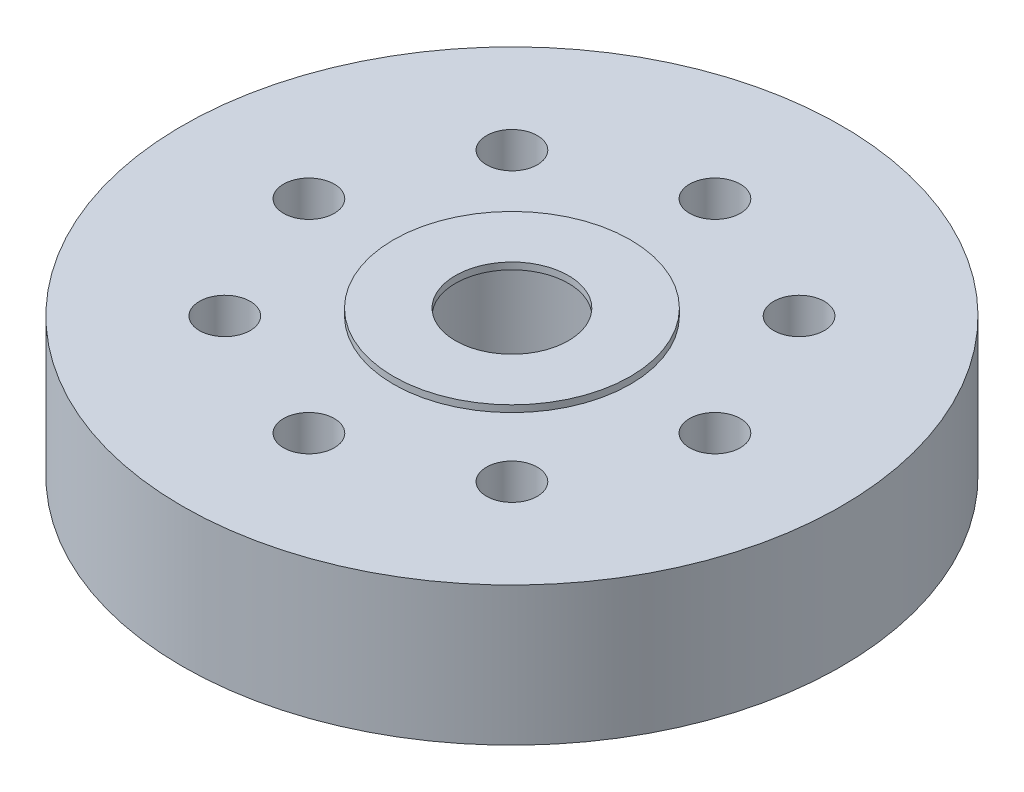
ISO-10303-21;
HEADER;
FILE_DESCRIPTION(('STEP AP214'),'2;1');
FILE_NAME('part.step','',(''),(''),'','','');
FILE_SCHEMA(('AUTOMOTIVE_DESIGN { 1 0 10303 214 1 1 1 1 }'));
ENDSEC;
DATA;
#1=APPLICATION_CONTEXT('core data for automotive mechanical design processes');
#2=APPLICATION_PROTOCOL_DEFINITION('international standard','automotive_design',2000,#1);
#3=PRODUCT_CONTEXT('',#1,'mechanical');
#4=PRODUCT('Part','Part','',(#3));
#5=PRODUCT_RELATED_PRODUCT_CATEGORY('part','',(#4));
#6=PRODUCT_DEFINITION_FORMATION('','',#4);
#7=PRODUCT_DEFINITION_CONTEXT('part definition',#1,'design');
#8=PRODUCT_DEFINITION('design','',#6,#7);
#9=PRODUCT_DEFINITION_SHAPE('','',#8);
#10=(LENGTH_UNIT() NAMED_UNIT(*) SI_UNIT(.MILLI.,.METRE.));
#11=(NAMED_UNIT(*) PLANE_ANGLE_UNIT() SI_UNIT($,.RADIAN.));
#12=(NAMED_UNIT(*) SI_UNIT($,.STERADIAN.) SOLID_ANGLE_UNIT());
#13=UNCERTAINTY_MEASURE_WITH_UNIT(LENGTH_MEASURE(1.E-05),#10,'distance_accuracy_value','');
#14=(GEOMETRIC_REPRESENTATION_CONTEXT(3) GLOBAL_UNCERTAINTY_ASSIGNED_CONTEXT((#13)) GLOBAL_UNIT_ASSIGNED_CONTEXT((#10,
#11,#12)) REPRESENTATION_CONTEXT('',''));
#15=CARTESIAN_POINT('',(0.,0.,0.));
#16=DIRECTION('',(0.,0.,1.));
#17=DIRECTION('',(1.,0.,0.));
#18=AXIS2_PLACEMENT_3D('',#15,#16,#17);
#19=CARTESIAN_POINT('',(0.,4.1,0.));
#20=DIRECTION('',(0.,1.,0.));
#21=DIRECTION('',(0.,0.,1.));
#22=AXIS2_PLACEMENT_3D('',#19,#20,#21);
#23=PLANE('',#22);
#24=CARTESIAN_POINT('',(6.,4.1,0.));
#25=DIRECTION('',(0.,1.,0.));
#26=DIRECTION('',(0.,0.,1.));
#27=AXIS2_PLACEMENT_3D('',#24,#25,#26);
#28=CIRCLE('',#27,0.749999999999998);
#29=CARTESIAN_POINT('',(6.,4.1,0.749999999999998));
#30=VERTEX_POINT('',#29);
#31=EDGE_CURVE('E104',#30,#30,#28,.T.);
#32=ORIENTED_EDGE('',*,*,#31,.F.);
#33=EDGE_LOOP('',(#32));
#34=FACE_BOUND('',#33,.T.);
#35=CARTESIAN_POINT('',(4.24264068711926,4.1,4.24264068711928));
#36=DIRECTION('',(0.,1.,0.));
#37=DIRECTION('',(0.,0.,1.));
#38=AXIS2_PLACEMENT_3D('',#35,#36,#37);
#39=CIRCLE('',#38,0.749999999999998);
#40=CARTESIAN_POINT('',(4.24264068711926,4.1,4.99264068711927));
#41=VERTEX_POINT('',#40);
#42=EDGE_CURVE('E98',#41,#41,#39,.T.);
#43=ORIENTED_EDGE('',*,*,#42,.F.);
#44=EDGE_LOOP('',(#43));
#45=FACE_BOUND('',#44,.T.);
#46=CARTESIAN_POINT('',(0.,4.1,5.99999999999996));
#47=DIRECTION('',(0.,1.,0.));
#48=DIRECTION('',(0.,0.,1.));
#49=AXIS2_PLACEMENT_3D('',#46,#47,#48);
#50=CIRCLE('',#49,0.749999999999998);
#51=CARTESIAN_POINT('',(0.,4.1,6.74999999999996));
#52=VERTEX_POINT('',#51);
#53=EDGE_CURVE('E92',#52,#52,#50,.T.);
#54=ORIENTED_EDGE('',*,*,#53,.F.);
#55=EDGE_LOOP('',(#54));
#56=FACE_BOUND('',#55,.T.);
#57=CARTESIAN_POINT('',(-4.24264068711931,4.1,4.24264068711922));
#58=DIRECTION('',(0.,1.,0.));
#59=DIRECTION('',(0.,0.,1.));
#60=AXIS2_PLACEMENT_3D('',#57,#58,#59);
#61=CIRCLE('',#60,0.749999999999998);
#62=CARTESIAN_POINT('',(-4.24264068711931,4.1,4.99264068711922));
#63=VERTEX_POINT('',#62);
#64=EDGE_CURVE('E86',#63,#63,#61,.T.);
#65=ORIENTED_EDGE('',*,*,#64,.F.);
#66=EDGE_LOOP('',(#65));
#67=FACE_BOUND('',#66,.T.);
#68=CARTESIAN_POINT('',(-6.,4.1,0.));
#69=DIRECTION('',(0.,1.,0.));
#70=DIRECTION('',(0.,0.,1.));
#71=AXIS2_PLACEMENT_3D('',#68,#69,#70);
#72=CIRCLE('',#71,0.749999999999998);
#73=CARTESIAN_POINT('',(-6.,4.1,0.749999999999927));
#74=VERTEX_POINT('',#73);
#75=EDGE_CURVE('E80',#74,#74,#72,.T.);
#76=ORIENTED_EDGE('',*,*,#75,.F.);
#77=EDGE_LOOP('',(#76));
#78=FACE_BOUND('',#77,.T.);
#79=CARTESIAN_POINT('',(-4.24264068711926,4.1,-4.24264068711935));
#80=DIRECTION('',(0.,1.,0.));
#81=DIRECTION('',(0.,0.,1.));
#82=AXIS2_PLACEMENT_3D('',#79,#80,#81);
#83=CIRCLE('',#82,0.749999999999998);
#84=CARTESIAN_POINT('',(-4.24264068711926,4.1,-3.49264068711935));
#85=VERTEX_POINT('',#84);
#86=EDGE_CURVE('E74',#85,#85,#83,.T.);
#87=ORIENTED_EDGE('',*,*,#86,.F.);
#88=EDGE_LOOP('',(#87));
#89=FACE_BOUND('',#88,.T.);
#90=CARTESIAN_POINT('',(0.,4.1,-6.00000000000004));
#91=DIRECTION('',(0.,1.,0.));
#92=DIRECTION('',(0.,0.,1.));
#93=AXIS2_PLACEMENT_3D('',#90,#91,#92);
#94=CIRCLE('',#93,0.749999999999999);
#95=CARTESIAN_POINT('',(0.,4.1,-5.25000000000004));
#96=VERTEX_POINT('',#95);
#97=EDGE_CURVE('E68',#96,#96,#94,.T.);
#98=ORIENTED_EDGE('',*,*,#97,.F.);
#99=EDGE_LOOP('',(#98));
#100=FACE_BOUND('',#99,.T.);
#101=CARTESIAN_POINT('',(4.24264068711931,4.1,-4.2426406871193));
#102=DIRECTION('',(0.,1.,0.));
#103=DIRECTION('',(0.,0.,1.));
#104=AXIS2_PLACEMENT_3D('',#101,#102,#103);
#105=CIRCLE('',#104,0.749999999999998);
#106=CARTESIAN_POINT('',(4.24264068711931,4.1,-3.4926406871193));
#107=VERTEX_POINT('',#106);
#108=EDGE_CURVE('E62',#107,#107,#105,.T.);
#109=ORIENTED_EDGE('',*,*,#108,.F.);
#110=EDGE_LOOP('',(#109));
#111=FACE_BOUND('',#110,.T.);
#112=CARTESIAN_POINT('',(0.,4.1,0.));
#113=DIRECTION('',(0.,1.,0.));
#114=DIRECTION('',(0.,0.,1.));
#115=AXIS2_PLACEMENT_3D('',#112,#113,#114);
#116=CIRCLE('',#115,3.5);
#117=CARTESIAN_POINT('',(0.,4.1,3.5));
#118=VERTEX_POINT('',#117);
#119=EDGE_CURVE('E50',#118,#118,#116,.T.);
#120=ORIENTED_EDGE('',*,*,#119,.F.);
#121=EDGE_LOOP('',(#120));
#122=FACE_BOUND('',#121,.T.);
#123=CARTESIAN_POINT('',(0.,4.1,0.));
#124=DIRECTION('',(0.,1.,0.));
#125=DIRECTION('',(0.,0.,1.));
#126=AXIS2_PLACEMENT_3D('',#123,#124,#125);
#127=CIRCLE('',#126,9.74);
#128=CARTESIAN_POINT('',(0.,4.1,9.74));
#129=VERTEX_POINT('',#128);
#130=EDGE_CURVE('E10',#129,#129,#127,.T.);
#131=ORIENTED_EDGE('',*,*,#130,.T.);
#132=EDGE_LOOP('',(#131));
#133=FACE_BOUND('',#132,.T.);
#134=ADVANCED_FACE('F31',(#34,#45,#56,#67,#78,#89,#100,#111,#122,#133),#23,.T.);
#135=CARTESIAN_POINT('',(0.,0.,0.));
#136=DIRECTION('',(0.,1.,0.));
#137=DIRECTION('',(0.,0.,1.));
#138=AXIS2_PLACEMENT_3D('',#135,#136,#137);
#139=PLANE('',#138);
#140=CARTESIAN_POINT('',(6.,0.,0.));
#141=DIRECTION('',(0.,1.,0.));
#142=DIRECTION('',(0.,0.,1.));
#143=AXIS2_PLACEMENT_3D('',#140,#141,#142);
#144=CIRCLE('',#143,0.749999999999998);
#145=CARTESIAN_POINT('',(6.,0.,0.749999999999998));
#146=VERTEX_POINT('',#145);
#147=EDGE_CURVE('E59',#146,#146,#144,.T.);
#148=ORIENTED_EDGE('',*,*,#147,.T.);
#149=EDGE_LOOP('',(#148));
#150=FACE_BOUND('',#149,.T.);
#151=CARTESIAN_POINT('',(4.24264068711926,0.,4.24264068711928));
#152=DIRECTION('',(0.,1.,0.));
#153=DIRECTION('',(0.,0.,1.));
#154=AXIS2_PLACEMENT_3D('',#151,#152,#153);
#155=CIRCLE('',#154,0.749999999999998);
#156=CARTESIAN_POINT('',(4.24264068711926,0.,4.99264068711927));
#157=VERTEX_POINT('',#156);
#158=EDGE_CURVE('E101',#157,#157,#155,.T.);
#159=ORIENTED_EDGE('',*,*,#158,.T.);
#160=EDGE_LOOP('',(#159));
#161=FACE_BOUND('',#160,.T.);
#162=CARTESIAN_POINT('',(0.,0.,5.99999999999996));
#163=DIRECTION('',(0.,1.,0.));
#164=DIRECTION('',(0.,0.,1.));
#165=AXIS2_PLACEMENT_3D('',#162,#163,#164);
#166=CIRCLE('',#165,0.749999999999998);
#167=CARTESIAN_POINT('',(0.,0.,6.74999999999996));
#168=VERTEX_POINT('',#167);
#169=EDGE_CURVE('E95',#168,#168,#166,.T.);
#170=ORIENTED_EDGE('',*,*,#169,.T.);
#171=EDGE_LOOP('',(#170));
#172=FACE_BOUND('',#171,.T.);
#173=CARTESIAN_POINT('',(-4.24264068711931,0.,4.24264068711922));
#174=DIRECTION('',(0.,1.,0.));
#175=DIRECTION('',(0.,0.,1.));
#176=AXIS2_PLACEMENT_3D('',#173,#174,#175);
#177=CIRCLE('',#176,0.749999999999998);
#178=CARTESIAN_POINT('',(-4.24264068711931,0.,4.99264068711922));
#179=VERTEX_POINT('',#178);
#180=EDGE_CURVE('E89',#179,#179,#177,.T.);
#181=ORIENTED_EDGE('',*,*,#180,.T.);
#182=EDGE_LOOP('',(#181));
#183=FACE_BOUND('',#182,.T.);
#184=CARTESIAN_POINT('',(-6.,0.,0.));
#185=DIRECTION('',(0.,1.,0.));
#186=DIRECTION('',(0.,0.,1.));
#187=AXIS2_PLACEMENT_3D('',#184,#185,#186);
#188=CIRCLE('',#187,0.749999999999998);
#189=CARTESIAN_POINT('',(-6.,0.,0.749999999999927));
#190=VERTEX_POINT('',#189);
#191=EDGE_CURVE('E83',#190,#190,#188,.T.);
#192=ORIENTED_EDGE('',*,*,#191,.T.);
#193=EDGE_LOOP('',(#192));
#194=FACE_BOUND('',#193,.T.);
#195=CARTESIAN_POINT('',(-4.24264068711926,0.,-4.24264068711935));
#196=DIRECTION('',(0.,1.,0.));
#197=DIRECTION('',(0.,0.,1.));
#198=AXIS2_PLACEMENT_3D('',#195,#196,#197);
#199=CIRCLE('',#198,0.749999999999998);
#200=CARTESIAN_POINT('',(-4.24264068711926,0.,-3.49264068711935));
#201=VERTEX_POINT('',#200);
#202=EDGE_CURVE('E77',#201,#201,#199,.T.);
#203=ORIENTED_EDGE('',*,*,#202,.T.);
#204=EDGE_LOOP('',(#203));
#205=FACE_BOUND('',#204,.T.);
#206=CARTESIAN_POINT('',(0.,0.,-6.00000000000004));
#207=DIRECTION('',(0.,1.,0.));
#208=DIRECTION('',(0.,0.,1.));
#209=AXIS2_PLACEMENT_3D('',#206,#207,#208);
#210=CIRCLE('',#209,0.749999999999999);
#211=CARTESIAN_POINT('',(0.,0.,-5.25000000000004));
#212=VERTEX_POINT('',#211);
#213=EDGE_CURVE('E71',#212,#212,#210,.T.);
#214=ORIENTED_EDGE('',*,*,#213,.T.);
#215=EDGE_LOOP('',(#214));
#216=FACE_BOUND('',#215,.T.);
#217=CARTESIAN_POINT('',(4.24264068711931,0.,-4.2426406871193));
#218=DIRECTION('',(0.,1.,0.));
#219=DIRECTION('',(0.,0.,1.));
#220=AXIS2_PLACEMENT_3D('',#217,#218,#219);
#221=CIRCLE('',#220,0.749999999999998);
#222=CARTESIAN_POINT('',(4.24264068711931,0.,-3.4926406871193));
#223=VERTEX_POINT('',#222);
#224=EDGE_CURVE('E65',#223,#223,#221,.T.);
#225=ORIENTED_EDGE('',*,*,#224,.T.);
#226=EDGE_LOOP('',(#225));
#227=FACE_BOUND('',#226,.T.);
#228=CARTESIAN_POINT('',(0.,0.,0.));
#229=DIRECTION('',(0.,1.,0.));
#230=DIRECTION('',(0.,0.,1.));
#231=AXIS2_PLACEMENT_3D('',#228,#229,#230);
#232=CIRCLE('',#231,9.74);
#233=CARTESIAN_POINT('',(0.,0.,9.74));
#234=VERTEX_POINT('',#233);
#235=EDGE_CURVE('E35',#234,#234,#232,.T.);
#236=ORIENTED_EDGE('',*,*,#235,.F.);
#237=EDGE_LOOP('',(#236));
#238=FACE_BOUND('',#237,.T.);
#239=CARTESIAN_POINT('',(0.,0.,0.));
#240=DIRECTION('',(0.,1.,0.));
#241=DIRECTION('',(0.,0.,1.));
#242=AXIS2_PLACEMENT_3D('',#239,#240,#241);
#243=CIRCLE('',#242,2.57);
#244=CARTESIAN_POINT('',(0.,0.,2.57));
#245=VERTEX_POINT('',#244);
#246=EDGE_CURVE('E42',#245,#245,#243,.T.);
#247=ORIENTED_EDGE('',*,*,#246,.T.);
#248=EDGE_LOOP('',(#247));
#249=FACE_BOUND('',#248,.T.);
#250=ADVANCED_FACE('F110',(#150,#161,#172,#183,#194,#205,#216,#227,#238,#249),#139,.F.);
#251=CARTESIAN_POINT('',(0.,4.1,0.));
#252=DIRECTION('',(0.,-1.,0.));
#253=DIRECTION('',(0.,0.,-1.));
#254=AXIS2_PLACEMENT_3D('',#251,#252,#253);
#255=CYLINDRICAL_SURFACE('',#254,9.74);
#256=ORIENTED_EDGE('',*,*,#130,.F.);
#257=EDGE_LOOP('',(#256));
#258=FACE_BOUND('',#257,.T.);
#259=ORIENTED_EDGE('',*,*,#235,.T.);
#260=EDGE_LOOP('',(#259));
#261=FACE_BOUND('',#260,.T.);
#262=ADVANCED_FACE('F33',(#258,#261),#255,.T.);
#263=CARTESIAN_POINT('',(0.,4.1,0.));
#264=DIRECTION('',(0.,-1.,0.));
#265=DIRECTION('',(0.,0.,-1.));
#266=AXIS2_PLACEMENT_3D('',#263,#264,#265);
#267=CYLINDRICAL_SURFACE('',#266,2.57);
#268=CARTESIAN_POINT('',(0.,4.1,0.));
#269=DIRECTION('',(0.,1.,0.));
#270=DIRECTION('',(0.,0.,1.));
#271=AXIS2_PLACEMENT_3D('',#268,#269,#270);
#272=CIRCLE('',#271,2.57);
#273=CARTESIAN_POINT('',(0.,4.1,2.57));
#274=VERTEX_POINT('',#273);
#275=EDGE_CURVE('E46',#274,#274,#272,.T.);
#276=ORIENTED_EDGE('',*,*,#275,.T.);
#277=EDGE_LOOP('',(#276));
#278=FACE_BOUND('',#277,.T.);
#279=ORIENTED_EDGE('',*,*,#246,.F.);
#280=EDGE_LOOP('',(#279));
#281=FACE_BOUND('',#280,.T.);
#282=ADVANCED_FACE('F158',(#278,#281),#267,.F.);
#283=CARTESIAN_POINT('',(0.,4.1,0.));
#284=DIRECTION('',(0.,1.,0.));
#285=DIRECTION('',(0.,0.,1.));
#286=AXIS2_PLACEMENT_3D('',#283,#284,#285);
#287=PLANE('',#286);
#288=CARTESIAN_POINT('',(0.,4.1,0.));
#289=DIRECTION('',(0.,1.,0.));
#290=DIRECTION('',(0.,0.,1.));
#291=AXIS2_PLACEMENT_3D('',#288,#289,#290);
#292=CIRCLE('',#291,1.67);
#293=CARTESIAN_POINT('',(0.,4.1,1.67));
#294=VERTEX_POINT('',#293);
#295=EDGE_CURVE('E56',#294,#294,#292,.T.);
#296=ORIENTED_EDGE('',*,*,#295,.T.);
#297=EDGE_LOOP('',(#296));
#298=FACE_BOUND('',#297,.T.);
#299=ORIENTED_EDGE('',*,*,#275,.F.);
#300=EDGE_LOOP('',(#299));
#301=FACE_BOUND('',#300,.T.);
#302=ADVANCED_FACE('F152',(#298,#301),#287,.F.);
#303=CARTESIAN_POINT('',(0.,4.3,0.));
#304=DIRECTION('',(0.,1.,0.));
#305=DIRECTION('',(0.,0.,1.));
#306=AXIS2_PLACEMENT_3D('',#303,#304,#305);
#307=PLANE('',#306);
#308=CARTESIAN_POINT('',(0.,4.3,0.));
#309=DIRECTION('',(0.,1.,0.));
#310=DIRECTION('',(0.,0.,1.));
#311=AXIS2_PLACEMENT_3D('',#308,#309,#310);
#312=CIRCLE('',#311,3.5);
#313=CARTESIAN_POINT('',(0.,4.3,3.5));
#314=VERTEX_POINT('',#313);
#315=EDGE_CURVE('E49',#314,#314,#312,.T.);
#316=ORIENTED_EDGE('',*,*,#315,.T.);
#317=EDGE_LOOP('',(#316));
#318=FACE_BOUND('',#317,.T.);
#319=CARTESIAN_POINT('',(0.,4.3,0.));
#320=DIRECTION('',(0.,1.,0.));
#321=DIRECTION('',(0.,0.,1.));
#322=AXIS2_PLACEMENT_3D('',#319,#320,#321);
#323=CIRCLE('',#322,1.67);
#324=CARTESIAN_POINT('',(0.,4.3,1.67));
#325=VERTEX_POINT('',#324);
#326=EDGE_CURVE('E53',#325,#325,#323,.T.);
#327=ORIENTED_EDGE('',*,*,#326,.F.);
#328=EDGE_LOOP('',(#327));
#329=FACE_BOUND('',#328,.T.);
#330=ADVANCED_FACE('F142',(#318,#329),#307,.T.);
#331=CARTESIAN_POINT('',(0.,4.3,0.));
#332=DIRECTION('',(0.,-1.,0.));
#333=DIRECTION('',(0.,0.,-1.));
#334=AXIS2_PLACEMENT_3D('',#331,#332,#333);
#335=CYLINDRICAL_SURFACE('',#334,3.5);
#336=ORIENTED_EDGE('',*,*,#315,.F.);
#337=EDGE_LOOP('',(#336));
#338=FACE_BOUND('',#337,.T.);
#339=ORIENTED_EDGE('',*,*,#119,.T.);
#340=EDGE_LOOP('',(#339));
#341=FACE_BOUND('',#340,.T.);
#342=ADVANCED_FACE('F139',(#338,#341),#335,.T.);
#343=CARTESIAN_POINT('',(0.,4.3,0.));
#344=DIRECTION('',(0.,-1.,0.));
#345=DIRECTION('',(0.,0.,-1.));
#346=AXIS2_PLACEMENT_3D('',#343,#344,#345);
#347=CYLINDRICAL_SURFACE('',#346,1.67);
#348=ORIENTED_EDGE('',*,*,#326,.T.);
#349=EDGE_LOOP('',(#348));
#350=FACE_BOUND('',#349,.T.);
#351=ORIENTED_EDGE('',*,*,#295,.F.);
#352=EDGE_LOOP('',(#351));
#353=FACE_BOUND('',#352,.T.);
#354=ADVANCED_FACE('F141',(#350,#353),#347,.F.);
#355=CARTESIAN_POINT('',(4.24264068711931,0.,-4.2426406871193));
#356=DIRECTION('',(0.,1.,0.));
#357=DIRECTION('',(0.,0.,1.));
#358=AXIS2_PLACEMENT_3D('',#355,#356,#357);
#359=CYLINDRICAL_SURFACE('',#358,0.749999999999998);
#360=ORIENTED_EDGE('',*,*,#224,.F.);
#361=EDGE_LOOP('',(#360));
#362=FACE_BOUND('',#361,.T.);
#363=ORIENTED_EDGE('',*,*,#108,.T.);
#364=EDGE_LOOP('',(#363));
#365=FACE_BOUND('',#364,.T.);
#366=ADVANCED_FACE('F149',(#362,#365),#359,.F.);
#367=CARTESIAN_POINT('',(0.,0.,-6.00000000000004));
#368=DIRECTION('',(0.,1.,0.));
#369=DIRECTION('',(0.,0.,1.));
#370=AXIS2_PLACEMENT_3D('',#367,#368,#369);
#371=CYLINDRICAL_SURFACE('',#370,0.749999999999999);
#372=ORIENTED_EDGE('',*,*,#213,.F.);
#373=EDGE_LOOP('',(#372));
#374=FACE_BOUND('',#373,.T.);
#375=ORIENTED_EDGE('',*,*,#97,.T.);
#376=EDGE_LOOP('',(#375));
#377=FACE_BOUND('',#376,.T.);
#378=ADVANCED_FACE('F217',(#374,#377),#371,.F.);
#379=CARTESIAN_POINT('',(-4.24264068711926,0.,-4.24264068711935));
#380=DIRECTION('',(0.,1.,0.));
#381=DIRECTION('',(0.,0.,1.));
#382=AXIS2_PLACEMENT_3D('',#379,#380,#381);
#383=CYLINDRICAL_SURFACE('',#382,0.749999999999998);
#384=ORIENTED_EDGE('',*,*,#202,.F.);
#385=EDGE_LOOP('',(#384));
#386=FACE_BOUND('',#385,.T.);
#387=ORIENTED_EDGE('',*,*,#86,.T.);
#388=EDGE_LOOP('',(#387));
#389=FACE_BOUND('',#388,.T.);
#390=ADVANCED_FACE('F227',(#386,#389),#383,.F.);
#391=CARTESIAN_POINT('',(-6.,0.,0.));
#392=DIRECTION('',(0.,1.,0.));
#393=DIRECTION('',(0.,0.,1.));
#394=AXIS2_PLACEMENT_3D('',#391,#392,#393);
#395=CYLINDRICAL_SURFACE('',#394,0.749999999999998);
#396=ORIENTED_EDGE('',*,*,#191,.F.);
#397=EDGE_LOOP('',(#396));
#398=FACE_BOUND('',#397,.T.);
#399=ORIENTED_EDGE('',*,*,#75,.T.);
#400=EDGE_LOOP('',(#399));
#401=FACE_BOUND('',#400,.T.);
#402=ADVANCED_FACE('F237',(#398,#401),#395,.F.);
#403=CARTESIAN_POINT('',(-4.24264068711931,0.,4.24264068711922));
#404=DIRECTION('',(0.,1.,0.));
#405=DIRECTION('',(0.,0.,1.));
#406=AXIS2_PLACEMENT_3D('',#403,#404,#405);
#407=CYLINDRICAL_SURFACE('',#406,0.749999999999998);
#408=ORIENTED_EDGE('',*,*,#180,.F.);
#409=EDGE_LOOP('',(#408));
#410=FACE_BOUND('',#409,.T.);
#411=ORIENTED_EDGE('',*,*,#64,.T.);
#412=EDGE_LOOP('',(#411));
#413=FACE_BOUND('',#412,.T.);
#414=ADVANCED_FACE('F247',(#410,#413),#407,.F.);
#415=CARTESIAN_POINT('',(0.,0.,5.99999999999996));
#416=DIRECTION('',(0.,1.,0.));
#417=DIRECTION('',(0.,0.,1.));
#418=AXIS2_PLACEMENT_3D('',#415,#416,#417);
#419=CYLINDRICAL_SURFACE('',#418,0.749999999999998);
#420=ORIENTED_EDGE('',*,*,#169,.F.);
#421=EDGE_LOOP('',(#420));
#422=FACE_BOUND('',#421,.T.);
#423=ORIENTED_EDGE('',*,*,#53,.T.);
#424=EDGE_LOOP('',(#423));
#425=FACE_BOUND('',#424,.T.);
#426=ADVANCED_FACE('F257',(#422,#425),#419,.F.);
#427=CARTESIAN_POINT('',(4.24264068711926,0.,4.24264068711928));
#428=DIRECTION('',(0.,1.,0.));
#429=DIRECTION('',(0.,0.,1.));
#430=AXIS2_PLACEMENT_3D('',#427,#428,#429);
#431=CYLINDRICAL_SURFACE('',#430,0.749999999999998);
#432=ORIENTED_EDGE('',*,*,#158,.F.);
#433=EDGE_LOOP('',(#432));
#434=FACE_BOUND('',#433,.T.);
#435=ORIENTED_EDGE('',*,*,#42,.T.);
#436=EDGE_LOOP('',(#435));
#437=FACE_BOUND('',#436,.T.);
#438=ADVANCED_FACE('F116',(#434,#437),#431,.F.);
#439=CARTESIAN_POINT('',(6.,0.,0.));
#440=DIRECTION('',(0.,1.,0.));
#441=DIRECTION('',(0.,0.,1.));
#442=AXIS2_PLACEMENT_3D('',#439,#440,#441);
#443=CYLINDRICAL_SURFACE('',#442,0.749999999999998);
#444=ORIENTED_EDGE('',*,*,#147,.F.);
#445=EDGE_LOOP('',(#444));
#446=FACE_BOUND('',#445,.T.);
#447=ORIENTED_EDGE('',*,*,#31,.T.);
#448=EDGE_LOOP('',(#447));
#449=FACE_BOUND('',#448,.T.);
#450=ADVANCED_FACE('F113',(#446,#449),#443,.F.);
#451=CLOSED_SHELL('',(#134,#250,#262,#282,#302,#330,#342,#354,#366,#378,#390,#402,#414,#426,
#438,#450));
#452=MANIFOLD_SOLID_BREP('B2',#451);
#453=ADVANCED_BREP_SHAPE_REPRESENTATION('',(#18,#452),#14);
#454=SHAPE_DEFINITION_REPRESENTATION(#9,#453);
ENDSEC;
END-ISO-10303-21;
